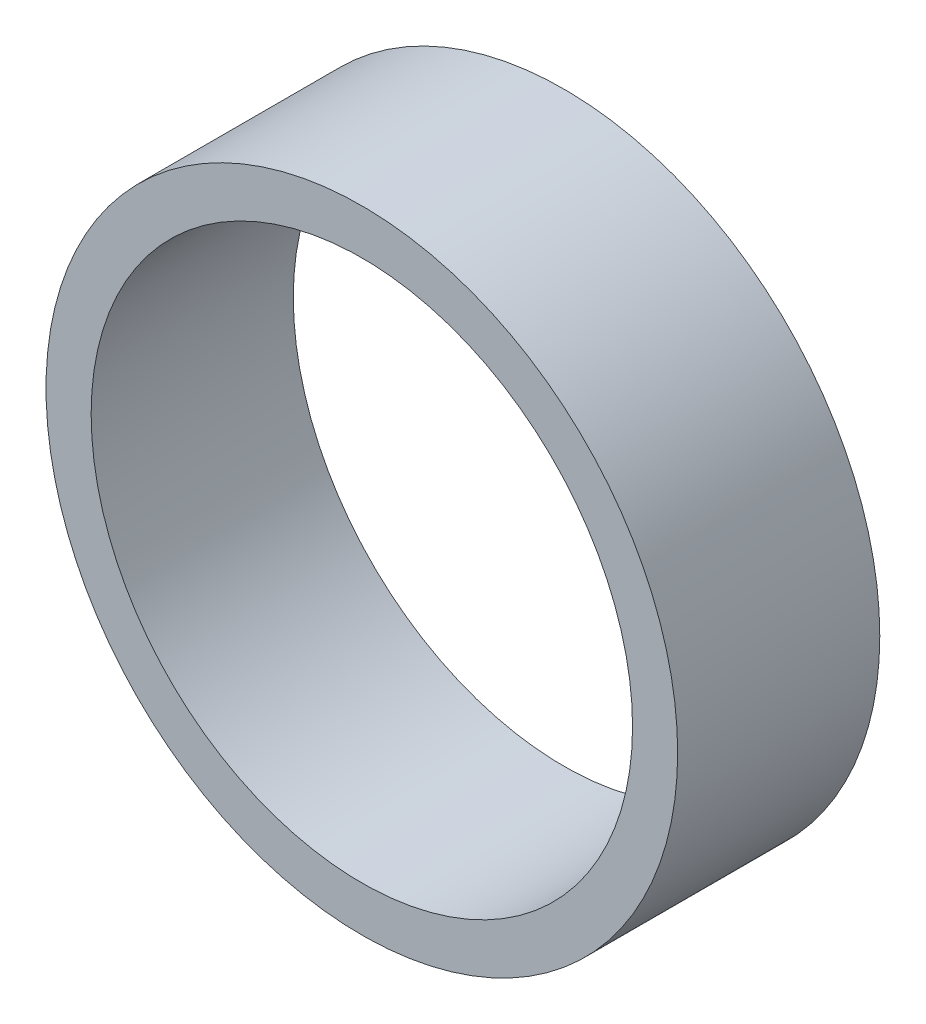
ISO-10303-21;
HEADER;
FILE_DESCRIPTION(('STEP AP214'),'2;1');
FILE_NAME('part.step','',(''),(''),'','','');
FILE_SCHEMA(('AUTOMOTIVE_DESIGN { 1 0 10303 214 1 1 1 1 }'));
ENDSEC;
DATA;
#1=APPLICATION_CONTEXT('core data for automotive mechanical design processes');
#2=APPLICATION_PROTOCOL_DEFINITION('international standard','automotive_design',2000,#1);
#3=PRODUCT_CONTEXT('',#1,'mechanical');
#4=PRODUCT('Part','Part','',(#3));
#5=PRODUCT_RELATED_PRODUCT_CATEGORY('part','',(#4));
#6=PRODUCT_DEFINITION_FORMATION('','',#4);
#7=PRODUCT_DEFINITION_CONTEXT('part definition',#1,'design');
#8=PRODUCT_DEFINITION('design','',#6,#7);
#9=PRODUCT_DEFINITION_SHAPE('','',#8);
#10=(LENGTH_UNIT() NAMED_UNIT(*) SI_UNIT(.MILLI.,.METRE.));
#11=(NAMED_UNIT(*) PLANE_ANGLE_UNIT() SI_UNIT($,.RADIAN.));
#12=(NAMED_UNIT(*) SI_UNIT($,.STERADIAN.) SOLID_ANGLE_UNIT());
#13=UNCERTAINTY_MEASURE_WITH_UNIT(LENGTH_MEASURE(1.E-05),#10,'distance_accuracy_value','');
#14=(GEOMETRIC_REPRESENTATION_CONTEXT(3) GLOBAL_UNCERTAINTY_ASSIGNED_CONTEXT((#13)) GLOBAL_UNIT_ASSIGNED_CONTEXT((#10,
#11,#12)) REPRESENTATION_CONTEXT('',''));
#15=CARTESIAN_POINT('',(0.,0.,0.));
#16=DIRECTION('',(0.,0.,1.));
#17=DIRECTION('',(1.,0.,0.));
#18=AXIS2_PLACEMENT_3D('',#15,#16,#17);
#19=CARTESIAN_POINT('',(0.,0.,7.112));
#20=DIRECTION('',(0.,0.,1.));
#21=DIRECTION('',(1.,0.,0.));
#22=AXIS2_PLACEMENT_3D('',#19,#20,#21);
#23=PLANE('',#22);
#24=CARTESIAN_POINT('',(0.,0.,7.112));
#25=DIRECTION('',(0.,0.,1.));
#26=DIRECTION('',(1.,0.,0.));
#27=AXIS2_PLACEMENT_3D('',#24,#25,#26);
#28=CIRCLE('',#27,11.1125);
#29=CARTESIAN_POINT('',(11.1125,0.,7.112));
#30=VERTEX_POINT('',#29);
#31=EDGE_CURVE('E10',#30,#30,#28,.T.);
#32=ORIENTED_EDGE('',*,*,#31,.T.);
#33=EDGE_LOOP('',(#32));
#34=FACE_BOUND('',#33,.T.);
#35=CARTESIAN_POINT('',(0.,0.,7.112));
#36=DIRECTION('',(0.,0.,1.));
#37=DIRECTION('',(1.,0.,0.));
#38=AXIS2_PLACEMENT_3D('',#35,#36,#37);
#39=CIRCLE('',#38,9.525);
#40=CARTESIAN_POINT('',(9.525,0.,7.112));
#41=VERTEX_POINT('',#40);
#42=EDGE_CURVE('E56',#41,#41,#39,.T.);
#43=ORIENTED_EDGE('',*,*,#42,.F.);
#44=EDGE_LOOP('',(#43));
#45=FACE_BOUND('',#44,.T.);
#46=ADVANCED_FACE('F41',(#34,#45),#23,.T.);
#47=CARTESIAN_POINT('',(0.,0.,0.));
#48=DIRECTION('',(0.,0.,1.));
#49=DIRECTION('',(1.,0.,0.));
#50=AXIS2_PLACEMENT_3D('',#47,#48,#49);
#51=PLANE('',#50);
#52=CARTESIAN_POINT('',(0.,0.,0.));
#53=DIRECTION('',(0.,0.,1.));
#54=DIRECTION('',(1.,0.,0.));
#55=AXIS2_PLACEMENT_3D('',#52,#53,#54);
#56=CIRCLE('',#55,11.1125);
#57=CARTESIAN_POINT('',(11.1125,0.,0.));
#58=VERTEX_POINT('',#57);
#59=EDGE_CURVE('E45',#58,#58,#56,.T.);
#60=ORIENTED_EDGE('',*,*,#59,.F.);
#61=EDGE_LOOP('',(#60));
#62=FACE_BOUND('',#61,.T.);
#63=CARTESIAN_POINT('',(0.,0.,0.));
#64=DIRECTION('',(0.,0.,1.));
#65=DIRECTION('',(1.,0.,0.));
#66=AXIS2_PLACEMENT_3D('',#63,#64,#65);
#67=CIRCLE('',#66,9.525);
#68=CARTESIAN_POINT('',(9.525,0.,0.));
#69=VERTEX_POINT('',#68);
#70=EDGE_CURVE('E58',#69,#69,#67,.T.);
#71=ORIENTED_EDGE('',*,*,#70,.T.);
#72=EDGE_LOOP('',(#71));
#73=FACE_BOUND('',#72,.T.);
#74=ADVANCED_FACE('F70',(#62,#73),#51,.F.);
#75=CARTESIAN_POINT('',(0.,0.,7.112));
#76=DIRECTION('',(0.,0.,-1.));
#77=DIRECTION('',(-1.,0.,0.));
#78=AXIS2_PLACEMENT_3D('',#75,#76,#77);
#79=CYLINDRICAL_SURFACE('',#78,11.1125);
#80=ORIENTED_EDGE('',*,*,#31,.F.);
#81=EDGE_LOOP('',(#80));
#82=FACE_BOUND('',#81,.T.);
#83=ORIENTED_EDGE('',*,*,#59,.T.);
#84=EDGE_LOOP('',(#83));
#85=FACE_BOUND('',#84,.T.);
#86=ADVANCED_FACE('F43',(#82,#85),#79,.T.);
#87=CARTESIAN_POINT('',(0.,0.,7.112));
#88=DIRECTION('',(0.,0.,-1.));
#89=DIRECTION('',(-1.,0.,0.));
#90=AXIS2_PLACEMENT_3D('',#87,#88,#89);
#91=CYLINDRICAL_SURFACE('',#90,9.525);
#92=ORIENTED_EDGE('',*,*,#42,.T.);
#93=EDGE_LOOP('',(#92));
#94=FACE_BOUND('',#93,.T.);
#95=ORIENTED_EDGE('',*,*,#70,.F.);
#96=EDGE_LOOP('',(#95));
#97=FACE_BOUND('',#96,.T.);
#98=ADVANCED_FACE('F66',(#94,#97),#91,.F.);
#99=CLOSED_SHELL('',(#46,#74,#86,#98));
#100=MANIFOLD_SOLID_BREP('B2',#99);
#101=ADVANCED_BREP_SHAPE_REPRESENTATION('',(#18,#100),#14);
#102=SHAPE_DEFINITION_REPRESENTATION(#9,#101);
ENDSEC;
END-ISO-10303-21;
